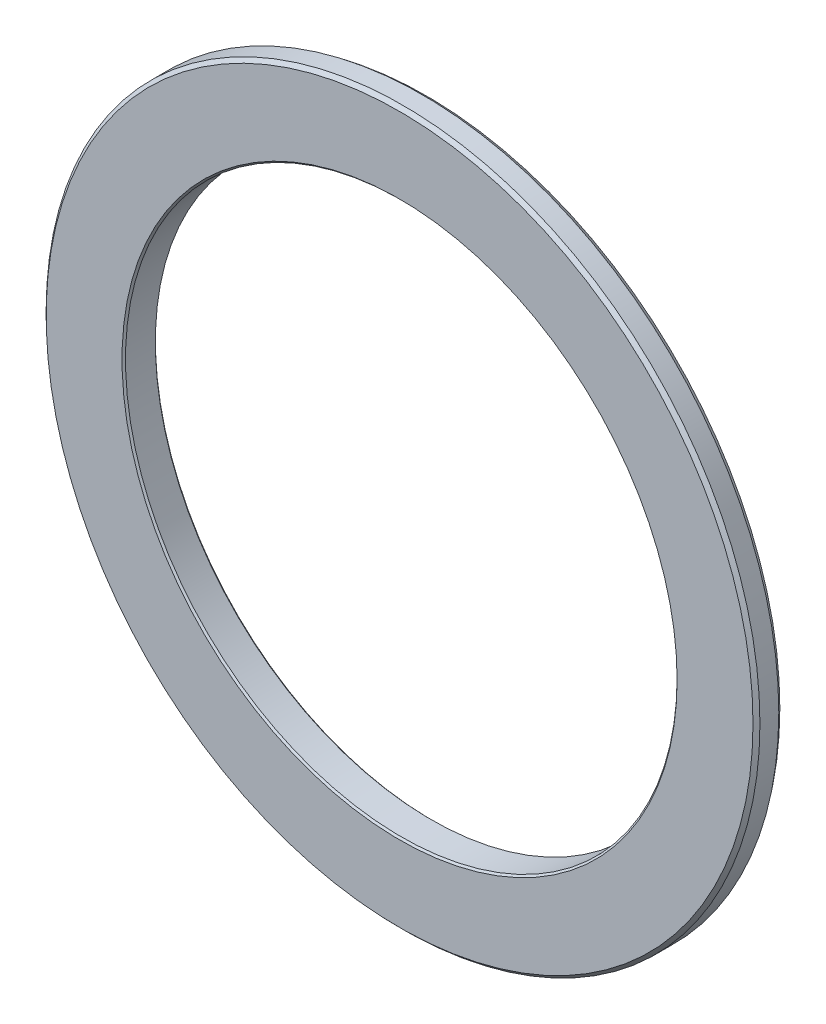
ISO-10303-21;
HEADER;
FILE_DESCRIPTION(('STEP AP214'),'2;1');
FILE_NAME('part.step','',(''),(''),'','','');
FILE_SCHEMA(('AUTOMOTIVE_DESIGN { 1 0 10303 214 1 1 1 1 }'));
ENDSEC;
DATA;
#1=APPLICATION_CONTEXT('core data for automotive mechanical design processes');
#2=APPLICATION_PROTOCOL_DEFINITION('international standard','automotive_design',2000,#1);
#3=PRODUCT_CONTEXT('',#1,'mechanical');
#4=PRODUCT('Part','Part','',(#3));
#5=PRODUCT_RELATED_PRODUCT_CATEGORY('part','',(#4));
#6=PRODUCT_DEFINITION_FORMATION('','',#4);
#7=PRODUCT_DEFINITION_CONTEXT('part definition',#1,'design');
#8=PRODUCT_DEFINITION('design','',#6,#7);
#9=PRODUCT_DEFINITION_SHAPE('','',#8);
#10=(LENGTH_UNIT() NAMED_UNIT(*) SI_UNIT(.MILLI.,.METRE.));
#11=(NAMED_UNIT(*) PLANE_ANGLE_UNIT() SI_UNIT($,.RADIAN.));
#12=(NAMED_UNIT(*) SI_UNIT($,.STERADIAN.) SOLID_ANGLE_UNIT());
#13=UNCERTAINTY_MEASURE_WITH_UNIT(LENGTH_MEASURE(1.E-05),#10,'distance_accuracy_value','');
#14=(GEOMETRIC_REPRESENTATION_CONTEXT(3) GLOBAL_UNCERTAINTY_ASSIGNED_CONTEXT((#13)) GLOBAL_UNIT_ASSIGNED_CONTEXT((#10,
#11,#12)) REPRESENTATION_CONTEXT('',''));
#15=CARTESIAN_POINT('',(0.,0.,0.));
#16=DIRECTION('',(0.,0.,1.));
#17=DIRECTION('',(1.,0.,0.));
#18=AXIS2_PLACEMENT_3D('',#15,#16,#17);
#19=CARTESIAN_POINT('',(0.,0.,1.92));
#20=DIRECTION('',(0.,0.,1.));
#21=DIRECTION('',(1.,0.,0.));
#22=AXIS2_PLACEMENT_3D('',#19,#20,#21);
#23=PLANE('',#22);
#24=CARTESIAN_POINT('',(0.,0.,1.92));
#25=DIRECTION('',(0.,0.,1.));
#26=DIRECTION('',(1.,0.,0.));
#27=AXIS2_PLACEMENT_3D('',#24,#25,#26);
#28=CIRCLE('',#27,16.);
#29=CARTESIAN_POINT('',(16.,0.,1.92));
#30=VERTEX_POINT('',#29);
#31=EDGE_CURVE('E10',#30,#30,#28,.F.);
#32=ORIENTED_EDGE('',*,*,#31,.T.);
#33=EDGE_LOOP('',(#32));
#34=FACE_BOUND('',#33,.T.);
#35=CARTESIAN_POINT('',(0.,0.,1.92));
#36=DIRECTION('',(0.,0.,1.));
#37=DIRECTION('',(1.,0.,0.));
#38=AXIS2_PLACEMENT_3D('',#35,#36,#37);
#39=CIRCLE('',#38,20.375);
#40=CARTESIAN_POINT('',(20.375,0.,1.92));
#41=VERTEX_POINT('',#40);
#42=EDGE_CURVE('E60',#41,#41,#39,.T.);
#43=ORIENTED_EDGE('',*,*,#42,.T.);
#44=EDGE_LOOP('',(#43));
#45=FACE_BOUND('',#44,.T.);
#46=ADVANCED_FACE('F31',(#34,#45),#23,.T.);
#47=CARTESIAN_POINT('',(0.,0.,0.));
#48=DIRECTION('',(0.,0.,1.));
#49=DIRECTION('',(1.,0.,0.));
#50=AXIS2_PLACEMENT_3D('',#47,#48,#49);
#51=PLANE('',#50);
#52=CARTESIAN_POINT('',(0.,0.,0.));
#53=DIRECTION('',(0.,0.,1.));
#54=DIRECTION('',(1.,0.,0.));
#55=AXIS2_PLACEMENT_3D('',#52,#53,#54);
#56=CIRCLE('',#55,16.);
#57=CARTESIAN_POINT('',(16.,0.,0.));
#58=VERTEX_POINT('',#57);
#59=EDGE_CURVE('E46',#58,#58,#56,.T.);
#60=ORIENTED_EDGE('',*,*,#59,.T.);
#61=EDGE_LOOP('',(#60));
#62=FACE_BOUND('',#61,.T.);
#63=CARTESIAN_POINT('',(0.,0.,0.));
#64=DIRECTION('',(0.,0.,1.));
#65=DIRECTION('',(1.,0.,0.));
#66=AXIS2_PLACEMENT_3D('',#63,#64,#65);
#67=CIRCLE('',#66,17.5749999999999);
#68=CARTESIAN_POINT('',(17.5749999999999,0.,0.));
#69=VERTEX_POINT('',#68);
#70=EDGE_CURVE('E63',#69,#69,#67,.F.);
#71=ORIENTED_EDGE('',*,*,#70,.T.);
#72=EDGE_LOOP('',(#71));
#73=FACE_BOUND('',#72,.T.);
#74=ADVANCED_FACE('F67',(#62,#73),#51,.F.);
#75=CARTESIAN_POINT('',(0.,0.,1.92));
#76=DIRECTION('',(0.,0.,-1.));
#77=DIRECTION('',(-1.,0.,0.));
#78=AXIS2_PLACEMENT_3D('',#75,#76,#77);
#79=CYLINDRICAL_SURFACE('',#78,20.575);
#80=CARTESIAN_POINT('',(0.,0.,1.72));
#81=DIRECTION('',(0.,0.,1.));
#82=DIRECTION('',(1.,0.,0.));
#83=AXIS2_PLACEMENT_3D('',#80,#81,#82);
#84=CIRCLE('',#83,20.575);
#85=CARTESIAN_POINT('',(20.575,0.,1.72));
#86=VERTEX_POINT('',#85);
#87=EDGE_CURVE('E54',#86,#86,#84,.F.);
#88=ORIENTED_EDGE('',*,*,#87,.T.);
#89=EDGE_LOOP('',(#88));
#90=FACE_BOUND('',#89,.T.);
#91=CARTESIAN_POINT('',(0.,0.,0.632811476160334));
#92=DIRECTION('',(0.,0.,-1.));
#93=DIRECTION('',(-1.,0.,0.));
#94=AXIS2_PLACEMENT_3D('',#91,#92,#93);
#95=CIRCLE('',#94,20.575);
#96=CARTESIAN_POINT('',(-20.575,0.,0.632811476160334));
#97=VERTEX_POINT('',#96);
#98=EDGE_CURVE('E57',#97,#97,#95,.F.);
#99=ORIENTED_EDGE('',*,*,#98,.T.);
#100=EDGE_LOOP('',(#99));
#101=FACE_BOUND('',#100,.T.);
#102=ADVANCED_FACE('F84',(#90,#101),#79,.T.);
#103=CARTESIAN_POINT('',(0.,0.,1.92));
#104=DIRECTION('',(0.,0.,-1.));
#105=DIRECTION('',(-1.,0.,0.));
#106=AXIS2_PLACEMENT_3D('',#103,#104,#105);
#107=CYLINDRICAL_SURFACE('',#106,15.9);
#108=CARTESIAN_POINT('',(0.,0.,0.100000000000003));
#109=DIRECTION('',(0.,0.,1.));
#110=DIRECTION('',(1.,0.,0.));
#111=AXIS2_PLACEMENT_3D('',#108,#109,#110);
#112=CIRCLE('',#111,15.9);
#113=CARTESIAN_POINT('',(15.9,0.,0.100000000000003));
#114=VERTEX_POINT('',#113);
#115=EDGE_CURVE('E38',#114,#114,#112,.F.);
#116=ORIENTED_EDGE('',*,*,#115,.T.);
#117=EDGE_LOOP('',(#116));
#118=FACE_BOUND('',#117,.T.);
#119=CARTESIAN_POINT('',(0.,0.,1.82));
#120=DIRECTION('',(0.,0.,1.));
#121=DIRECTION('',(1.,0.,0.));
#122=AXIS2_PLACEMENT_3D('',#119,#120,#121);
#123=CIRCLE('',#122,15.9);
#124=CARTESIAN_POINT('',(15.9,0.,1.82));
#125=VERTEX_POINT('',#124);
#126=EDGE_CURVE('E42',#125,#125,#123,.T.);
#127=ORIENTED_EDGE('',*,*,#126,.T.);
#128=EDGE_LOOP('',(#127));
#129=FACE_BOUND('',#128,.T.);
#130=ADVANCED_FACE('F72',(#118,#129),#107,.F.);
#131=CARTESIAN_POINT('',(0.,0.,0.4));
#132=DIRECTION('',(0.,0.,1.));
#133=DIRECTION('',(1.,0.,0.));
#134=AXIS2_PLACEMENT_3D('',#131,#132,#133);
#135=CONICAL_SURFACE('',#134,20.575,1.43824479449823);
#136=CARTESIAN_POINT('',(0.,0.,0.37356725598181));
#137=DIRECTION('',(0.,0.,1.));
#138=DIRECTION('',(1.,0.,0.));
#139=AXIS2_PLACEMENT_3D('',#136,#137,#138);
#140=CIRCLE('',#139,20.3767544198635);
#141=CARTESIAN_POINT('',(20.3767544198636,0.,0.37356725598181));
#142=VERTEX_POINT('',#141);
#143=EDGE_CURVE('E51',#142,#142,#140,.F.);
#144=CARTESIAN_POINT('',(20.3767544198636,0.,0.37356725598181));
#145=CARTESIAN_POINT('',(20.34756947799,0.,0.369675930398666));
#146=CARTESIAN_POINT('',(20.3183845361164,0.,0.365784604815523));
#147=CARTESIAN_POINT('',(20.2600146523693,0.,0.358001953649235));
#148=CARTESIAN_POINT('',(20.2308297104957,0.,0.354110628066091));
#149=CARTESIAN_POINT('',(20.1724598267485,0.,0.346327976899803));
#150=CARTESIAN_POINT('',(20.1432748848749,0.,0.34243665131666));
#151=CARTESIAN_POINT('',(20.0849050011278,0.,0.334654000150372));
#152=CARTESIAN_POINT('',(20.0557200592542,0.,0.330762674567228));
#153=CARTESIAN_POINT('',(19.997350175507,0.,0.32298002340094));
#154=CARTESIAN_POINT('',(19.9681652336335,0.,0.319088697817796));
#155=CARTESIAN_POINT('',(19.9097953498863,0.,0.311306046651509));
#156=CARTESIAN_POINT('',(19.8806104080127,0.,0.307414721068365));
#157=CARTESIAN_POINT('',(19.8222405242656,0.,0.299632069902077));
#158=CARTESIAN_POINT('',(19.793055582392,0.,0.295740744318933));
#159=CARTESIAN_POINT('',(19.7346856986448,0.,0.287958093152646));
#160=CARTESIAN_POINT('',(19.7055007567712,0.,0.284066767569502));
#161=CARTESIAN_POINT('',(19.6471308730241,0.,0.276284116403214));
#162=CARTESIAN_POINT('',(19.6179459311505,0.,0.27239279082007));
#163=CARTESIAN_POINT('',(19.5595760474033,0.,0.264610139653782));
#164=CARTESIAN_POINT('',(19.5303911055298,0.,0.260718814070639));
#165=CARTESIAN_POINT('',(19.4720212217826,0.,0.252936162904351));
#166=CARTESIAN_POINT('',(19.442836279909,0.,0.249044837321207));
#167=CARTESIAN_POINT('',(19.3844663961619,0.,0.241262186154919));
#168=CARTESIAN_POINT('',(19.3552814542883,0.,0.237370860571775));
#169=CARTESIAN_POINT('',(19.2969115705411,0.,0.229588209405488));
#170=CARTESIAN_POINT('',(19.2677266286675,0.,0.225696883822344));
#171=CARTESIAN_POINT('',(19.2093567449204,0.,0.217914232656056));
#172=CARTESIAN_POINT('',(19.1801718030468,0.,0.214022907072912));
#173=CARTESIAN_POINT('',(19.1218019192996,0.,0.206240255906624));
#174=CARTESIAN_POINT('',(19.0926169774261,0.,0.202348930323481));
#175=CARTESIAN_POINT('',(19.0342470936789,0.,0.194566279157193));
#176=CARTESIAN_POINT('',(19.0050621518053,0.,0.190674953574049));
#177=CARTESIAN_POINT('',(18.9466922680582,0.,0.182892302407761));
#178=CARTESIAN_POINT('',(18.9175073261846,0.,0.179000976824617));
#179=CARTESIAN_POINT('',(18.8591374424374,0.,0.17121832565833));
#180=CARTESIAN_POINT('',(18.8299525005638,0.,0.167327000075186));
#181=CARTESIAN_POINT('',(18.7715826168167,0.,0.159544348908898));
#182=CARTESIAN_POINT('',(18.7423976749431,0.,0.155653023325754));
#183=CARTESIAN_POINT('',(18.6840277911959,0.,0.147870372159467));
#184=CARTESIAN_POINT('',(18.6548428493224,0.,0.143979046576323));
#185=CARTESIAN_POINT('',(18.5964729655752,0.,0.136196395410035));
#186=CARTESIAN_POINT('',(18.5672880237016,0.,0.132305069826891));
#187=CARTESIAN_POINT('',(18.5089181399545,0.,0.124522418660603));
#188=CARTESIAN_POINT('',(18.4797331980809,0.,0.120631093077459));
#189=CARTESIAN_POINT('',(18.4213633143337,0.,0.112848441911172));
#190=CARTESIAN_POINT('',(18.3921783724601,0.,0.108957116328028));
#191=CARTESIAN_POINT('',(18.333808488713,0.,0.10117446516174));
#192=CARTESIAN_POINT('',(18.3046235468394,0.,0.0972831395785964));
#193=CARTESIAN_POINT('',(18.2462536630922,0.,0.0895004884123087));
#194=CARTESIAN_POINT('',(18.2170687212187,0.,0.0856091628291648));
#195=CARTESIAN_POINT('',(18.1586988374715,0.,0.0778265116628771));
#196=CARTESIAN_POINT('',(18.1295138955979,0.,0.0739351860797333));
#197=CARTESIAN_POINT('',(18.0711440118508,0.,0.0661525349134455));
#198=CARTESIAN_POINT('',(18.0419590699772,0.,0.0622612093303016));
#199=CARTESIAN_POINT('',(17.98358918623,0.,0.0544785581640139));
#200=CARTESIAN_POINT('',(17.9544042443565,0.,0.0505872325808702));
#201=CARTESIAN_POINT('',(17.8960343606093,0.,0.0428045814145825));
#202=CARTESIAN_POINT('',(17.8668494187357,0.,0.0389132558314386));
#203=CARTESIAN_POINT('',(17.8084795349886,0.,0.0311306046651508));
#204=CARTESIAN_POINT('',(17.779294593115,0.,0.0272392790820069));
#205=CARTESIAN_POINT('',(17.7209247093678,0.,0.0194566279157192));
#206=CARTESIAN_POINT('',(17.6917397674942,0.,0.0155653023325754));
#207=CARTESIAN_POINT('',(17.6333698837471,0.,0.00778265116628766));
#208=CARTESIAN_POINT('',(17.6041849418735,0.,0.0038913255831438));
#209=CARTESIAN_POINT('',(17.5749999999999,0.,0.));
#210=B_SPLINE_CURVE_WITH_KNOTS('',3,(#144,#145,#146,#147,#148,#149,#150,#151,#152,#153,#154,
#155,#156,#157,#158,#159,#160,#161,#162,#163,#164,#165,#166,#167,#168,#169,#170,#171,#172,#173,
#174,#175,#176,#177,#178,#179,#180,#181,#182,#183,#184,#185,#186,#187,#188,#189,#190,#191,#192,
#193,#194,#195,#196,#197,#198,#199,#200,#201,#202,#203,#204,#205,#206,#207,#208,#209),
.UNSPECIFIED.,.F.,.F.,(4,2,2,2,2,2,2,2,2,2,2,2,2,2,2,2,2,2,2,2,2,2,2,2,2,2,2,2,2,2,2,2,4),(0.,
0.0883296621901397,0.176659324380283,0.264988986570423,0.353318648760562,0.441648310950702,
0.529977973140842,0.618307635330985,0.706637297521125,0.794966959711265,0.883296621901404,
0.971626284091544,1.05995594628168,1.14828560847183,1.23661527066197,1.32494493285211,
1.41327459504225,1.50160425723239,1.58993391942253,1.67826358161267,1.76659324380281,
1.85492290599295,1.94325256818309,2.03158223037323,2.11991189256337,2.20824155475351,
2.29657121694365,2.38490087913379,2.47323054132393,2.56156020351407,2.64988986570421,
2.73821952789435,2.82654919008449),.UNSPECIFIED.);
#211=EDGE_CURVE('BSEAM69',#142,#69,#210,.T.);
#212=ORIENTED_EDGE('',*,*,#143,.T.);
#213=ORIENTED_EDGE('',*,*,#70,.F.);
#214=ORIENTED_EDGE('',*,*,#211,.T.);
#215=ORIENTED_EDGE('',*,*,#211,.F.);
#216=EDGE_LOOP('',(#212,#214,#213,#215));
#217=FACE_BOUND('',#216,.T.);
#218=ADVANCED_FACE('F69',(#217),#135,.T.);
#219=CARTESIAN_POINT('',(0.,0.,1.92));
#220=DIRECTION('',(0.,0.,-1.));
#221=DIRECTION('',(-1.,0.,0.));
#222=AXIS2_PLACEMENT_3D('',#219,#220,#221);
#223=CONICAL_SURFACE('',#222,20.375,0.785398163397448);
#224=ORIENTED_EDGE('',*,*,#87,.F.);
#225=EDGE_LOOP('',(#224));
#226=FACE_BOUND('',#225,.T.);
#227=ORIENTED_EDGE('',*,*,#42,.F.);
#228=EDGE_LOOP('',(#227));
#229=FACE_BOUND('',#228,.T.);
#230=ADVANCED_FACE('F71',(#226,#229),#223,.T.);
#231=CARTESIAN_POINT('',(0.,0.,0.632811476160334));
#232=DIRECTION('',(0.,0.,1.));
#233=DIRECTION('',(1.,0.,0.));
#234=AXIS2_PLACEMENT_3D('',#231,#232,#233);
#235=CONICAL_SURFACE('',#234,20.575,0.652846631100798);
#236=ORIENTED_EDGE('',*,*,#143,.F.);
#237=EDGE_LOOP('',(#236));
#238=FACE_BOUND('',#237,.T.);
#239=ORIENTED_EDGE('',*,*,#98,.F.);
#240=EDGE_LOOP('',(#239));
#241=FACE_BOUND('',#240,.T.);
#242=ADVANCED_FACE('F80',(#238,#241),#235,.T.);
#243=CARTESIAN_POINT('',(0.,0.,0.));
#244=DIRECTION('',(0.,0.,-1.));
#245=DIRECTION('',(-1.,0.,0.));
#246=AXIS2_PLACEMENT_3D('',#243,#244,#245);
#247=CONICAL_SURFACE('',#246,16.,0.785398163397431);
#248=ORIENTED_EDGE('',*,*,#115,.F.);
#249=EDGE_LOOP('',(#248));
#250=FACE_BOUND('',#249,.T.);
#251=ORIENTED_EDGE('',*,*,#59,.F.);
#252=EDGE_LOOP('',(#251));
#253=FACE_BOUND('',#252,.T.);
#254=ADVANCED_FACE('F104',(#250,#253),#247,.F.);
#255=CARTESIAN_POINT('',(0.,0.,1.82));
#256=DIRECTION('',(0.,0.,1.));
#257=DIRECTION('',(1.,0.,0.));
#258=AXIS2_PLACEMENT_3D('',#255,#256,#257);
#259=CONICAL_SURFACE('',#258,15.9,0.785398163397448);
#260=ORIENTED_EDGE('',*,*,#31,.F.);
#261=EDGE_LOOP('',(#260));
#262=FACE_BOUND('',#261,.T.);
#263=ORIENTED_EDGE('',*,*,#126,.F.);
#264=EDGE_LOOP('',(#263));
#265=FACE_BOUND('',#264,.T.);
#266=ADVANCED_FACE('F33',(#262,#265),#259,.F.);
#267=CLOSED_SHELL('',(#46,#74,#102,#130,#218,#230,#242,#254,#266));
#268=MANIFOLD_SOLID_BREP('B2',#267);
#269=ADVANCED_BREP_SHAPE_REPRESENTATION('',(#18,#268),#14);
#270=SHAPE_DEFINITION_REPRESENTATION(#9,#269);
ENDSEC;
END-ISO-10303-21;
